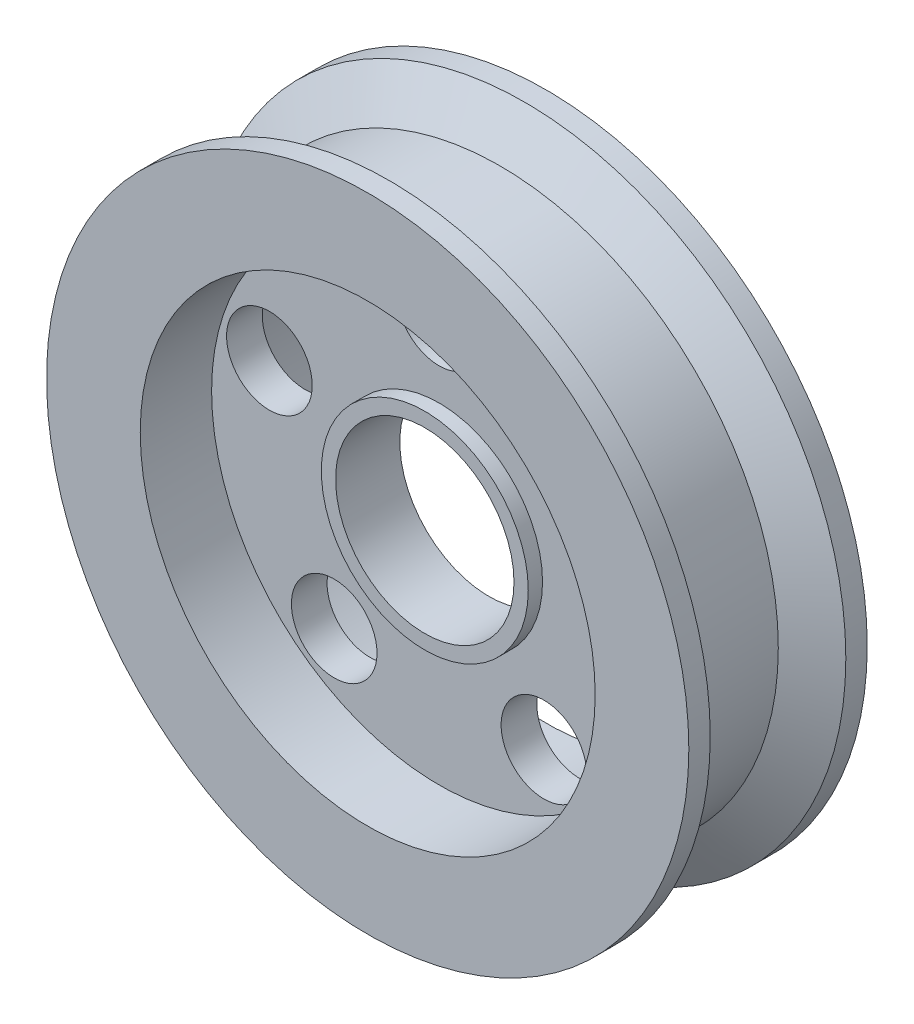
ISO-10303-21;
HEADER;
FILE_DESCRIPTION(('STEP AP214'),'2;1');
FILE_NAME('part.step','',(''),(''),'','','');
FILE_SCHEMA(('AUTOMOTIVE_DESIGN { 1 0 10303 214 1 1 1 1 }'));
ENDSEC;
DATA;
#1=APPLICATION_CONTEXT('core data for automotive mechanical design processes');
#2=APPLICATION_PROTOCOL_DEFINITION('international standard','automotive_design',2000,#1);
#3=PRODUCT_CONTEXT('',#1,'mechanical');
#4=PRODUCT('Part','Part','',(#3));
#5=PRODUCT_RELATED_PRODUCT_CATEGORY('part','',(#4));
#6=PRODUCT_DEFINITION_FORMATION('','',#4);
#7=PRODUCT_DEFINITION_CONTEXT('part definition',#1,'design');
#8=PRODUCT_DEFINITION('design','',#6,#7);
#9=PRODUCT_DEFINITION_SHAPE('','',#8);
#10=(LENGTH_UNIT() NAMED_UNIT(*) SI_UNIT(.MILLI.,.METRE.));
#11=(NAMED_UNIT(*) PLANE_ANGLE_UNIT() SI_UNIT($,.RADIAN.));
#12=(NAMED_UNIT(*) SI_UNIT($,.STERADIAN.) SOLID_ANGLE_UNIT());
#13=UNCERTAINTY_MEASURE_WITH_UNIT(LENGTH_MEASURE(1.E-05),#10,'distance_accuracy_value','');
#14=(GEOMETRIC_REPRESENTATION_CONTEXT(3) GLOBAL_UNCERTAINTY_ASSIGNED_CONTEXT((#13)) GLOBAL_UNIT_ASSIGNED_CONTEXT((#10,
#11,#12)) REPRESENTATION_CONTEXT('',''));
#15=CARTESIAN_POINT('',(0.,0.,0.));
#16=DIRECTION('',(0.,0.,1.));
#17=DIRECTION('',(1.,0.,0.));
#18=AXIS2_PLACEMENT_3D('',#15,#16,#17);
#19=CARTESIAN_POINT('',(0.,0.,12.5));
#20=DIRECTION('',(0.,0.,-1.));
#21=DIRECTION('',(-1.,0.,0.));
#22=AXIS2_PLACEMENT_3D('',#19,#20,#21);
#23=CYLINDRICAL_SURFACE('',#22,45.);
#24=CARTESIAN_POINT('',(0.,0.,-9.5));
#25=DIRECTION('',(0.,0.,1.));
#26=DIRECTION('',(1.,0.,0.));
#27=AXIS2_PLACEMENT_3D('',#24,#25,#26);
#28=CIRCLE('',#27,45.);
#29=CARTESIAN_POINT('',(45.,0.,-9.5));
#30=VERTEX_POINT('',#29);
#31=EDGE_CURVE('E174',#30,#30,#28,.T.);
#32=ORIENTED_EDGE('',*,*,#31,.F.);
#33=EDGE_LOOP('',(#32));
#34=FACE_BOUND('',#33,.T.);
#35=CARTESIAN_POINT('',(0.,0.,-12.5));
#36=DIRECTION('',(0.,0.,1.));
#37=DIRECTION('',(1.,0.,0.));
#38=AXIS2_PLACEMENT_3D('',#35,#36,#37);
#39=CIRCLE('',#38,45.);
#40=CARTESIAN_POINT('',(45.,0.,-12.5));
#41=VERTEX_POINT('',#40);
#42=EDGE_CURVE('E93',#41,#41,#39,.T.);
#43=ORIENTED_EDGE('',*,*,#42,.T.);
#44=EDGE_LOOP('',(#43));
#45=FACE_BOUND('',#44,.T.);
#46=ADVANCED_FACE('F47',(#34,#45),#23,.T.);
#47=CARTESIAN_POINT('',(0.,0.,12.5));
#48=DIRECTION('',(0.,0.,1.));
#49=DIRECTION('',(1.,0.,0.));
#50=AXIS2_PLACEMENT_3D('',#47,#48,#49);
#51=PLANE('',#50);
#52=CARTESIAN_POINT('',(0.,0.,12.5));
#53=DIRECTION('',(0.,0.,1.));
#54=DIRECTION('',(1.,0.,0.));
#55=AXIS2_PLACEMENT_3D('',#52,#53,#54);
#56=CIRCLE('',#55,31.875);
#57=CARTESIAN_POINT('',(31.875,0.,12.5));
#58=VERTEX_POINT('',#57);
#59=EDGE_CURVE('E86',#58,#58,#56,.T.);
#60=ORIENTED_EDGE('',*,*,#59,.F.);
#61=EDGE_LOOP('',(#60));
#62=FACE_BOUND('',#61,.T.);
#63=CARTESIAN_POINT('',(0.,0.,12.5));
#64=DIRECTION('',(0.,0.,1.));
#65=DIRECTION('',(1.,0.,0.));
#66=AXIS2_PLACEMENT_3D('',#63,#64,#65);
#67=CIRCLE('',#66,45.);
#68=CARTESIAN_POINT('',(45.,0.,12.5));
#69=VERTEX_POINT('',#68);
#70=EDGE_CURVE('E59',#69,#69,#67,.T.);
#71=ORIENTED_EDGE('',*,*,#70,.T.);
#72=EDGE_LOOP('',(#71));
#73=FACE_BOUND('',#72,.T.);
#74=ADVANCED_FACE('F140',(#62,#73),#51,.T.);
#75=CARTESIAN_POINT('',(0.,0.,-12.5));
#76=DIRECTION('',(0.,0.,1.));
#77=DIRECTION('',(1.,0.,0.));
#78=AXIS2_PLACEMENT_3D('',#75,#76,#77);
#79=PLANE('',#78);
#80=CARTESIAN_POINT('',(0.,0.,-12.5));
#81=DIRECTION('',(0.,0.,1.));
#82=DIRECTION('',(1.,0.,0.));
#83=AXIS2_PLACEMENT_3D('',#80,#81,#82);
#84=CIRCLE('',#83,31.875);
#85=CARTESIAN_POINT('',(31.875,0.,-12.5));
#86=VERTEX_POINT('',#85);
#87=EDGE_CURVE('E87',#86,#86,#84,.T.);
#88=ORIENTED_EDGE('',*,*,#87,.T.);
#89=EDGE_LOOP('',(#88));
#90=FACE_BOUND('',#89,.T.);
#91=ORIENTED_EDGE('',*,*,#42,.F.);
#92=EDGE_LOOP('',(#91));
#93=FACE_BOUND('',#92,.T.);
#94=ADVANCED_FACE('F137',(#90,#93),#79,.F.);
#95=CARTESIAN_POINT('',(0.,0.,9.5));
#96=DIRECTION('',(0.,0.,1.));
#97=DIRECTION('',(1.,0.,0.));
#98=AXIS2_PLACEMENT_3D('',#95,#96,#97);
#99=CIRCLE('',#98,45.);
#100=CARTESIAN_POINT('',(45.,0.,9.5));
#101=VERTEX_POINT('',#100);
#102=EDGE_CURVE('E162',#101,#101,#99,.T.);
#103=ORIENTED_EDGE('',*,*,#102,.T.);
#104=EDGE_LOOP('',(#103));
#105=FACE_BOUND('',#104,.T.);
#106=ORIENTED_EDGE('',*,*,#70,.F.);
#107=EDGE_LOOP('',(#106));
#108=FACE_BOUND('',#107,.T.);
#109=ADVANCED_FACE('F49',(#105,#108),#23,.T.);
#110=CARTESIAN_POINT('',(0.,0.,2.5));
#111=DIRECTION('',(0.,0.,1.));
#112=DIRECTION('',(1.,0.,0.));
#113=AXIS2_PLACEMENT_3D('',#110,#111,#112);
#114=CYLINDRICAL_SURFACE('',#113,31.875);
#115=CARTESIAN_POINT('',(0.,0.,2.5));
#116=DIRECTION('',(0.,0.,1.));
#117=DIRECTION('',(1.,0.,0.));
#118=AXIS2_PLACEMENT_3D('',#115,#116,#117);
#119=CIRCLE('',#118,31.875);
#120=CARTESIAN_POINT('',(31.875,0.,2.5));
#121=VERTEX_POINT('',#120);
#122=EDGE_CURVE('E90',#121,#121,#119,.T.);
#123=ORIENTED_EDGE('',*,*,#122,.F.);
#124=EDGE_LOOP('',(#123));
#125=FACE_BOUND('',#124,.T.);
#126=ORIENTED_EDGE('',*,*,#59,.T.);
#127=EDGE_LOOP('',(#126));
#128=FACE_BOUND('',#127,.T.);
#129=ADVANCED_FACE('F152',(#125,#128),#114,.F.);
#130=CARTESIAN_POINT('',(0.,0.,2.5));
#131=DIRECTION('',(0.,0.,1.));
#132=DIRECTION('',(1.,0.,0.));
#133=AXIS2_PLACEMENT_3D('',#130,#131,#132);
#134=PLANE('',#133);
#135=CARTESIAN_POINT('',(0.,0.,2.5));
#136=DIRECTION('',(0.,0.,1.));
#137=DIRECTION('',(1.,0.,0.));
#138=AXIS2_PLACEMENT_3D('',#135,#136,#137);
#139=CIRCLE('',#138,14.5);
#140=CARTESIAN_POINT('',(14.5,0.,2.5));
#141=VERTEX_POINT('',#140);
#142=EDGE_CURVE('E10',#141,#141,#139,.T.);
#143=ORIENTED_EDGE('',*,*,#142,.F.);
#144=EDGE_LOOP('',(#143));
#145=FACE_BOUND('',#144,.T.);
#146=CARTESIAN_POINT('',(-14.6946313073117,-20.2254248593738,2.5));
#147=DIRECTION('',(0.,0.,1.));
#148=DIRECTION('',(-0.809016994374951,0.587785252292469,0.));
#149=AXIS2_PLACEMENT_3D('',#146,#147,#148);
#150=CIRCLE('',#149,6.);
#151=CARTESIAN_POINT('',(-8.69463130731171,-20.2254248593738,2.5));
#152=VERTEX_POINT('',#151);
#153=EDGE_CURVE('E64',#152,#152,#150,.T.);
#154=ORIENTED_EDGE('',*,*,#153,.F.);
#155=EDGE_LOOP('',(#154));
#156=FACE_BOUND('',#155,.T.);
#157=CARTESIAN_POINT('',(14.694631307312,-20.2254248593736,2.5));
#158=DIRECTION('',(0.,0.,1.));
#159=DIRECTION('',(-0.809016994374942,-0.58778525229248,0.));
#160=AXIS2_PLACEMENT_3D('',#157,#158,#159);
#161=CIRCLE('',#160,6.);
#162=CARTESIAN_POINT('',(20.694631307312,-20.2254248593736,2.5));
#163=VERTEX_POINT('',#162);
#164=EDGE_CURVE('E68',#163,#163,#161,.T.);
#165=ORIENTED_EDGE('',*,*,#164,.F.);
#166=EDGE_LOOP('',(#165));
#167=FACE_BOUND('',#166,.T.);
#168=CARTESIAN_POINT('',(23.7764129073788,7.72542485937396,2.5));
#169=DIRECTION('',(0.,0.,1.));
#170=DIRECTION('',(0.309016994374958,-0.95105651629515,0.));
#171=AXIS2_PLACEMENT_3D('',#168,#169,#170);
#172=CIRCLE('',#171,6.);
#173=CARTESIAN_POINT('',(29.7764129073788,7.72542485937396,2.5));
#174=VERTEX_POINT('',#173);
#175=EDGE_CURVE('E71',#174,#174,#172,.T.);
#176=ORIENTED_EDGE('',*,*,#175,.F.);
#177=EDGE_LOOP('',(#176));
#178=FACE_BOUND('',#177,.T.);
#179=CARTESIAN_POINT('',(-23.7764129073789,7.72542485937362,2.5));
#180=DIRECTION('',(0.,0.,1.));
#181=DIRECTION('',(0.309016994374945,0.951056516295155,0.));
#182=AXIS2_PLACEMENT_3D('',#179,#180,#181);
#183=CIRCLE('',#182,6.);
#184=CARTESIAN_POINT('',(-17.7764129073789,7.72542485937362,2.5));
#185=VERTEX_POINT('',#184);
#186=EDGE_CURVE('E74',#185,#185,#183,.T.);
#187=ORIENTED_EDGE('',*,*,#186,.F.);
#188=EDGE_LOOP('',(#187));
#189=FACE_BOUND('',#188,.T.);
#190=CARTESIAN_POINT('',(0.,25.,2.5));
#191=DIRECTION('',(0.,0.,1.));
#192=DIRECTION('',(1.,0.,0.));
#193=AXIS2_PLACEMENT_3D('',#190,#191,#192);
#194=CIRCLE('',#193,6.);
#195=CARTESIAN_POINT('',(6.,25.,2.5));
#196=VERTEX_POINT('',#195);
#197=EDGE_CURVE('E79',#196,#196,#194,.T.);
#198=ORIENTED_EDGE('',*,*,#197,.F.);
#199=EDGE_LOOP('',(#198));
#200=FACE_BOUND('',#199,.T.);
#201=ORIENTED_EDGE('',*,*,#122,.T.);
#202=EDGE_LOOP('',(#201));
#203=FACE_BOUND('',#202,.T.);
#204=ADVANCED_FACE('F133',(#145,#156,#167,#178,#189,#200,#203),#134,.T.);
#205=CARTESIAN_POINT('',(0.,0.,-2.5));
#206=DIRECTION('',(0.,0.,-1.));
#207=DIRECTION('',(-1.,0.,0.));
#208=AXIS2_PLACEMENT_3D('',#205,#206,#207);
#209=CYLINDRICAL_SURFACE('',#208,31.875);
#210=CARTESIAN_POINT('',(0.,0.,-2.5));
#211=DIRECTION('',(0.,0.,1.));
#212=DIRECTION('',(1.,0.,0.));
#213=AXIS2_PLACEMENT_3D('',#210,#211,#212);
#214=CIRCLE('',#213,31.875);
#215=CARTESIAN_POINT('',(31.875,0.,-2.5));
#216=VERTEX_POINT('',#215);
#217=EDGE_CURVE('E83',#216,#216,#214,.T.);
#218=ORIENTED_EDGE('',*,*,#217,.T.);
#219=EDGE_LOOP('',(#218));
#220=FACE_BOUND('',#219,.T.);
#221=ORIENTED_EDGE('',*,*,#87,.F.);
#222=EDGE_LOOP('',(#221));
#223=FACE_BOUND('',#222,.T.);
#224=ADVANCED_FACE('F118',(#220,#223),#209,.F.);
#225=CARTESIAN_POINT('',(0.,0.,-2.5));
#226=DIRECTION('',(0.,0.,-1.));
#227=DIRECTION('',(1.,0.,0.));
#228=AXIS2_PLACEMENT_3D('',#225,#226,#227);
#229=PLANE('',#228);
#230=CARTESIAN_POINT('',(0.,0.,-2.5));
#231=DIRECTION('',(0.,0.,-1.));
#232=DIRECTION('',(-1.,0.,0.));
#233=AXIS2_PLACEMENT_3D('',#230,#231,#232);
#234=CIRCLE('',#233,14.5);
#235=CARTESIAN_POINT('',(-14.5,0.,-2.5));
#236=VERTEX_POINT('',#235);
#237=EDGE_CURVE('E51',#236,#236,#234,.T.);
#238=ORIENTED_EDGE('',*,*,#237,.F.);
#239=EDGE_LOOP('',(#238));
#240=FACE_BOUND('',#239,.T.);
#241=CARTESIAN_POINT('',(-14.6946313073117,-20.2254248593738,-2.5));
#242=DIRECTION('',(0.,0.,-1.));
#243=DIRECTION('',(-1.,0.,0.));
#244=AXIS2_PLACEMENT_3D('',#241,#242,#243);
#245=CIRCLE('',#244,6.);
#246=CARTESIAN_POINT('',(-8.69463130731171,-20.2254248593738,-2.5));
#247=VERTEX_POINT('',#246);
#248=EDGE_CURVE('E78',#247,#247,#245,.T.);
#249=ORIENTED_EDGE('',*,*,#248,.F.);
#250=EDGE_LOOP('',(#249));
#251=FACE_BOUND('',#250,.T.);
#252=CARTESIAN_POINT('',(14.694631307312,-20.2254248593736,-2.5));
#253=DIRECTION('',(0.,0.,-1.));
#254=DIRECTION('',(-1.,0.,0.));
#255=AXIS2_PLACEMENT_3D('',#252,#253,#254);
#256=CIRCLE('',#255,6.);
#257=CARTESIAN_POINT('',(20.694631307312,-20.2254248593736,-2.5));
#258=VERTEX_POINT('',#257);
#259=EDGE_CURVE('E106',#258,#258,#256,.T.);
#260=ORIENTED_EDGE('',*,*,#259,.F.);
#261=EDGE_LOOP('',(#260));
#262=FACE_BOUND('',#261,.T.);
#263=CARTESIAN_POINT('',(23.7764129073788,7.72542485937396,-2.5));
#264=DIRECTION('',(0.,0.,-1.));
#265=DIRECTION('',(-1.,0.,0.));
#266=AXIS2_PLACEMENT_3D('',#263,#264,#265);
#267=CIRCLE('',#266,6.);
#268=CARTESIAN_POINT('',(29.7764129073788,7.72542485937396,-2.5));
#269=VERTEX_POINT('',#268);
#270=EDGE_CURVE('E67',#269,#269,#267,.T.);
#271=ORIENTED_EDGE('',*,*,#270,.F.);
#272=EDGE_LOOP('',(#271));
#273=FACE_BOUND('',#272,.T.);
#274=CARTESIAN_POINT('',(-23.7764129073789,7.72542485937362,-2.5));
#275=DIRECTION('',(0.,0.,-1.));
#276=DIRECTION('',(-1.,0.,0.));
#277=AXIS2_PLACEMENT_3D('',#274,#275,#276);
#278=CIRCLE('',#277,6.);
#279=CARTESIAN_POINT('',(-17.7764129073789,7.72542485937362,-2.5));
#280=VERTEX_POINT('',#279);
#281=EDGE_CURVE('E77',#280,#280,#278,.T.);
#282=ORIENTED_EDGE('',*,*,#281,.F.);
#283=EDGE_LOOP('',(#282));
#284=FACE_BOUND('',#283,.T.);
#285=CARTESIAN_POINT('',(0.,25.,-2.5));
#286=DIRECTION('',(0.,0.,-1.));
#287=DIRECTION('',(-1.,0.,0.));
#288=AXIS2_PLACEMENT_3D('',#285,#286,#287);
#289=CIRCLE('',#288,6.);
#290=CARTESIAN_POINT('',(6.,25.,-2.5));
#291=VERTEX_POINT('',#290);
#292=EDGE_CURVE('E82',#291,#291,#289,.T.);
#293=ORIENTED_EDGE('',*,*,#292,.F.);
#294=EDGE_LOOP('',(#293));
#295=FACE_BOUND('',#294,.T.);
#296=ORIENTED_EDGE('',*,*,#217,.F.);
#297=EDGE_LOOP('',(#296));
#298=FACE_BOUND('',#297,.T.);
#299=ADVANCED_FACE('F114',(#240,#251,#262,#273,#284,#295,#298),#229,.T.);
#300=CARTESIAN_POINT('',(0.,25.,-12.5));
#301=DIRECTION('',(0.,0.,1.));
#302=DIRECTION('',(1.,0.,0.));
#303=AXIS2_PLACEMENT_3D('',#300,#301,#302);
#304=CYLINDRICAL_SURFACE('',#303,6.);
#305=CARTESIAN_POINT('',(6.,25.,-2.5));
#306=CARTESIAN_POINT('',(6.,25.,-2.44791666666667));
#307=CARTESIAN_POINT('',(6.,25.,-2.39583333333333));
#308=CARTESIAN_POINT('',(6.,25.,-2.29166666666667));
#309=CARTESIAN_POINT('',(6.,25.,-2.23958333333333));
#310=CARTESIAN_POINT('',(6.,25.,-2.13541666666667));
#311=CARTESIAN_POINT('',(6.,25.,-2.08333333333333));
#312=CARTESIAN_POINT('',(6.,25.,-1.97916666666667));
#313=CARTESIAN_POINT('',(6.,25.,-1.92708333333333));
#314=CARTESIAN_POINT('',(6.,25.,-1.82291666666667));
#315=CARTESIAN_POINT('',(6.,25.,-1.77083333333333));
#316=CARTESIAN_POINT('',(6.,25.,-1.66666666666667));
#317=CARTESIAN_POINT('',(6.,25.,-1.61458333333333));
#318=CARTESIAN_POINT('',(6.,25.,-1.51041666666667));
#319=CARTESIAN_POINT('',(6.,25.,-1.45833333333333));
#320=CARTESIAN_POINT('',(6.,25.,-1.35416666666667));
#321=CARTESIAN_POINT('',(6.,25.,-1.30208333333333));
#322=CARTESIAN_POINT('',(6.,25.,-1.19791666666667));
#323=CARTESIAN_POINT('',(6.,25.,-1.14583333333333));
#324=CARTESIAN_POINT('',(6.,25.,-1.04166666666667));
#325=CARTESIAN_POINT('',(6.,25.,-0.989583333333334));
#326=CARTESIAN_POINT('',(6.,25.,-0.885416666666668));
#327=CARTESIAN_POINT('',(6.,25.,-0.833333333333334));
#328=CARTESIAN_POINT('',(6.,25.,-0.729166666666667));
#329=CARTESIAN_POINT('',(6.,25.,-0.677083333333334));
#330=CARTESIAN_POINT('',(6.,25.,-0.572916666666667));
#331=CARTESIAN_POINT('',(6.,25.,-0.520833333333334));
#332=CARTESIAN_POINT('',(6.,25.,-0.416666666666667));
#333=CARTESIAN_POINT('',(6.,25.,-0.364583333333334));
#334=CARTESIAN_POINT('',(6.,25.,-0.260416666666667));
#335=CARTESIAN_POINT('',(6.,25.,-0.208333333333334));
#336=CARTESIAN_POINT('',(6.,25.,-0.104166666666667));
#337=CARTESIAN_POINT('',(6.,25.,-0.0520833333333334));
#338=CARTESIAN_POINT('',(6.,25.,0.0520833333333334));
#339=CARTESIAN_POINT('',(6.,25.,0.104166666666667));
#340=CARTESIAN_POINT('',(6.,25.,0.208333333333334));
#341=CARTESIAN_POINT('',(6.,25.,0.260416666666667));
#342=CARTESIAN_POINT('',(6.,25.,0.364583333333334));
#343=CARTESIAN_POINT('',(6.,25.,0.416666666666667));
#344=CARTESIAN_POINT('',(6.,25.,0.520833333333334));
#345=CARTESIAN_POINT('',(6.,25.,0.572916666666667));
#346=CARTESIAN_POINT('',(6.,25.,0.677083333333334));
#347=CARTESIAN_POINT('',(6.,25.,0.729166666666667));
#348=CARTESIAN_POINT('',(6.,25.,0.833333333333333));
#349=CARTESIAN_POINT('',(6.,25.,0.885416666666666));
#350=CARTESIAN_POINT('',(6.,25.,0.989583333333333));
#351=CARTESIAN_POINT('',(6.,25.,1.04166666666667));
#352=CARTESIAN_POINT('',(6.,25.,1.14583333333333));
#353=CARTESIAN_POINT('',(6.,25.,1.19791666666667));
#354=CARTESIAN_POINT('',(6.,25.,1.30208333333333));
#355=CARTESIAN_POINT('',(6.,25.,1.35416666666667));
#356=CARTESIAN_POINT('',(6.,25.,1.45833333333333));
#357=CARTESIAN_POINT('',(6.,25.,1.51041666666667));
#358=CARTESIAN_POINT('',(6.,25.,1.61458333333333));
#359=CARTESIAN_POINT('',(6.,25.,1.66666666666667));
#360=CARTESIAN_POINT('',(6.,25.,1.77083333333333));
#361=CARTESIAN_POINT('',(6.,25.,1.82291666666667));
#362=CARTESIAN_POINT('',(6.,25.,1.92708333333333));
#363=CARTESIAN_POINT('',(6.,25.,1.97916666666667));
#364=CARTESIAN_POINT('',(6.,25.,2.08333333333333));
#365=CARTESIAN_POINT('',(6.,25.,2.13541666666667));
#366=CARTESIAN_POINT('',(6.,25.,2.23958333333333));
#367=CARTESIAN_POINT('',(6.,25.,2.29166666666667));
#368=CARTESIAN_POINT('',(6.,25.,2.39583333333333));
#369=CARTESIAN_POINT('',(6.,25.,2.44791666666667));
#370=CARTESIAN_POINT('',(6.,25.,2.5));
#371=B_SPLINE_CURVE_WITH_KNOTS('',3,(#305,#306,#307,#308,#309,#310,#311,#312,#313,#314,#315,
#316,#317,#318,#319,#320,#321,#322,#323,#324,#325,#326,#327,#328,#329,#330,#331,#332,#333,#334,
#335,#336,#337,#338,#339,#340,#341,#342,#343,#344,#345,#346,#347,#348,#349,#350,#351,#352,#353,
#354,#355,#356,#357,#358,#359,#360,#361,#362,#363,#364,#365,#366,#367,#368,#369,#370),
.UNSPECIFIED.,.F.,.F.,(4,2,2,2,2,2,2,2,2,2,2,2,2,2,2,2,2,2,2,2,2,2,2,2,2,2,2,2,2,2,2,2,4),(0.,
0.15625,0.3125,0.46875,0.625000000000001,0.781250000000001,0.937500000000001,1.09375,1.25,
1.40625,1.5625,1.71875,1.875,2.03125,2.1875,2.34375,2.5,2.65625,2.8125,2.96875,3.125,3.28125,
3.4375,3.59375,3.75,3.90625,4.0625,4.21875,4.375,4.53125,4.6875,4.84375,5.),.UNSPECIFIED.);
#372=EDGE_CURVE('BSEAM117',#291,#196,#371,.T.);
#373=ORIENTED_EDGE('',*,*,#292,.T.);
#374=ORIENTED_EDGE('',*,*,#197,.T.);
#375=ORIENTED_EDGE('',*,*,#372,.T.);
#376=ORIENTED_EDGE('',*,*,#372,.F.);
#377=EDGE_LOOP('',(#373,#375,#374,#376));
#378=FACE_BOUND('',#377,.T.);
#379=ADVANCED_FACE('F117',(#378),#304,.F.);
#380=CARTESIAN_POINT('',(-23.7764129073789,7.72542485937362,-12.5));
#381=DIRECTION('',(0.,0.,1.));
#382=DIRECTION('',(1.,0.,0.));
#383=AXIS2_PLACEMENT_3D('',#380,#381,#382);
#384=CYLINDRICAL_SURFACE('',#383,6.);
#385=CARTESIAN_POINT('',(-17.7764129073789,7.72542485937362,-2.5));
#386=CARTESIAN_POINT('',(-17.7764129073789,7.72542485937362,-2.44791666666667));
#387=CARTESIAN_POINT('',(-17.7764129073789,7.72542485937362,-2.39583333333333));
#388=CARTESIAN_POINT('',(-17.7764129073789,7.72542485937362,-2.29166666666667));
#389=CARTESIAN_POINT('',(-17.7764129073789,7.72542485937362,-2.23958333333333));
#390=CARTESIAN_POINT('',(-17.7764129073789,7.72542485937362,-2.13541666666667));
#391=CARTESIAN_POINT('',(-17.7764129073789,7.72542485937362,-2.08333333333333));
#392=CARTESIAN_POINT('',(-17.7764129073789,7.72542485937362,-1.97916666666667));
#393=CARTESIAN_POINT('',(-17.7764129073789,7.72542485937362,-1.92708333333333));
#394=CARTESIAN_POINT('',(-17.7764129073789,7.72542485937362,-1.82291666666667));
#395=CARTESIAN_POINT('',(-17.7764129073789,7.72542485937362,-1.77083333333333));
#396=CARTESIAN_POINT('',(-17.7764129073789,7.72542485937362,-1.66666666666667));
#397=CARTESIAN_POINT('',(-17.7764129073789,7.72542485937362,-1.61458333333333));
#398=CARTESIAN_POINT('',(-17.7764129073789,7.72542485937362,-1.51041666666667));
#399=CARTESIAN_POINT('',(-17.7764129073789,7.72542485937362,-1.45833333333333));
#400=CARTESIAN_POINT('',(-17.7764129073789,7.72542485937362,-1.35416666666667));
#401=CARTESIAN_POINT('',(-17.7764129073789,7.72542485937362,-1.30208333333333));
#402=CARTESIAN_POINT('',(-17.7764129073789,7.72542485937362,-1.19791666666667));
#403=CARTESIAN_POINT('',(-17.7764129073789,7.72542485937362,-1.14583333333333));
#404=CARTESIAN_POINT('',(-17.7764129073789,7.72542485937362,-1.04166666666667));
#405=CARTESIAN_POINT('',(-17.7764129073789,7.72542485937362,-0.989583333333334));
#406=CARTESIAN_POINT('',(-17.7764129073789,7.72542485937362,-0.885416666666668));
#407=CARTESIAN_POINT('',(-17.7764129073789,7.72542485937362,-0.833333333333334));
#408=CARTESIAN_POINT('',(-17.7764129073789,7.72542485937362,-0.729166666666667));
#409=CARTESIAN_POINT('',(-17.7764129073789,7.72542485937362,-0.677083333333334));
#410=CARTESIAN_POINT('',(-17.7764129073789,7.72542485937362,-0.572916666666667));
#411=CARTESIAN_POINT('',(-17.7764129073789,7.72542485937362,-0.520833333333334));
#412=CARTESIAN_POINT('',(-17.7764129073789,7.72542485937362,-0.416666666666667));
#413=CARTESIAN_POINT('',(-17.7764129073789,7.72542485937362,-0.364583333333334));
#414=CARTESIAN_POINT('',(-17.7764129073789,7.72542485937362,-0.260416666666667));
#415=CARTESIAN_POINT('',(-17.7764129073789,7.72542485937362,-0.208333333333334));
#416=CARTESIAN_POINT('',(-17.7764129073789,7.72542485937362,-0.104166666666667));
#417=CARTESIAN_POINT('',(-17.7764129073789,7.72542485937362,-0.0520833333333334));
#418=CARTESIAN_POINT('',(-17.7764129073789,7.72542485937362,0.0520833333333334));
#419=CARTESIAN_POINT('',(-17.7764129073789,7.72542485937362,0.104166666666667));
#420=CARTESIAN_POINT('',(-17.7764129073789,7.72542485937362,0.208333333333334));
#421=CARTESIAN_POINT('',(-17.7764129073789,7.72542485937362,0.260416666666667));
#422=CARTESIAN_POINT('',(-17.7764129073789,7.72542485937362,0.364583333333334));
#423=CARTESIAN_POINT('',(-17.7764129073789,7.72542485937362,0.416666666666667));
#424=CARTESIAN_POINT('',(-17.7764129073789,7.72542485937362,0.520833333333334));
#425=CARTESIAN_POINT('',(-17.7764129073789,7.72542485937362,0.572916666666667));
#426=CARTESIAN_POINT('',(-17.7764129073789,7.72542485937362,0.677083333333334));
#427=CARTESIAN_POINT('',(-17.7764129073789,7.72542485937362,0.729166666666667));
#428=CARTESIAN_POINT('',(-17.7764129073789,7.72542485937362,0.833333333333333));
#429=CARTESIAN_POINT('',(-17.7764129073789,7.72542485937362,0.885416666666666));
#430=CARTESIAN_POINT('',(-17.7764129073789,7.72542485937362,0.989583333333333));
#431=CARTESIAN_POINT('',(-17.7764129073789,7.72542485937362,1.04166666666667));
#432=CARTESIAN_POINT('',(-17.7764129073789,7.72542485937362,1.14583333333333));
#433=CARTESIAN_POINT('',(-17.7764129073789,7.72542485937362,1.19791666666667));
#434=CARTESIAN_POINT('',(-17.7764129073789,7.72542485937362,1.30208333333333));
#435=CARTESIAN_POINT('',(-17.7764129073789,7.72542485937362,1.35416666666667));
#436=CARTESIAN_POINT('',(-17.7764129073789,7.72542485937362,1.45833333333333));
#437=CARTESIAN_POINT('',(-17.7764129073789,7.72542485937362,1.51041666666667));
#438=CARTESIAN_POINT('',(-17.7764129073789,7.72542485937362,1.61458333333333));
#439=CARTESIAN_POINT('',(-17.7764129073789,7.72542485937362,1.66666666666667));
#440=CARTESIAN_POINT('',(-17.7764129073789,7.72542485937362,1.77083333333333));
#441=CARTESIAN_POINT('',(-17.7764129073789,7.72542485937362,1.82291666666667));
#442=CARTESIAN_POINT('',(-17.7764129073789,7.72542485937362,1.92708333333333));
#443=CARTESIAN_POINT('',(-17.7764129073789,7.72542485937362,1.97916666666667));
#444=CARTESIAN_POINT('',(-17.7764129073789,7.72542485937362,2.08333333333333));
#445=CARTESIAN_POINT('',(-17.7764129073789,7.72542485937362,2.13541666666667));
#446=CARTESIAN_POINT('',(-17.7764129073789,7.72542485937362,2.23958333333333));
#447=CARTESIAN_POINT('',(-17.7764129073789,7.72542485937362,2.29166666666667));
#448=CARTESIAN_POINT('',(-17.7764129073789,7.72542485937362,2.39583333333333));
#449=CARTESIAN_POINT('',(-17.7764129073789,7.72542485937362,2.44791666666667));
#450=CARTESIAN_POINT('',(-17.7764129073789,7.72542485937362,2.5));
#451=B_SPLINE_CURVE_WITH_KNOTS('',3,(#385,#386,#387,#388,#389,#390,#391,#392,#393,#394,#395,
#396,#397,#398,#399,#400,#401,#402,#403,#404,#405,#406,#407,#408,#409,#410,#411,#412,#413,#414,
#415,#416,#417,#418,#419,#420,#421,#422,#423,#424,#425,#426,#427,#428,#429,#430,#431,#432,#433,
#434,#435,#436,#437,#438,#439,#440,#441,#442,#443,#444,#445,#446,#447,#448,#449,#450),
.UNSPECIFIED.,.F.,.F.,(4,2,2,2,2,2,2,2,2,2,2,2,2,2,2,2,2,2,2,2,2,2,2,2,2,2,2,2,2,2,2,2,4),(0.,
0.15625,0.3125,0.46875,0.625000000000001,0.781250000000001,0.937500000000001,1.09375,1.25,
1.40625,1.5625,1.71875,1.875,2.03125,2.1875,2.34375,2.5,2.65625,2.8125,2.96875,3.125,3.28125,
3.4375,3.59375,3.75,3.90625,4.0625,4.21875,4.375,4.53125,4.6875,4.84375,5.),.UNSPECIFIED.);
#452=EDGE_CURVE('BSEAM214',#280,#185,#451,.T.);
#453=ORIENTED_EDGE('',*,*,#281,.T.);
#454=ORIENTED_EDGE('',*,*,#186,.T.);
#455=ORIENTED_EDGE('',*,*,#452,.T.);
#456=ORIENTED_EDGE('',*,*,#452,.F.);
#457=EDGE_LOOP('',(#453,#455,#454,#456));
#458=FACE_BOUND('',#457,.T.);
#459=ADVANCED_FACE('F214',(#458),#384,.F.);
#460=CARTESIAN_POINT('',(23.7764129073788,7.72542485937396,-12.5));
#461=DIRECTION('',(0.,0.,1.));
#462=DIRECTION('',(1.,0.,0.));
#463=AXIS2_PLACEMENT_3D('',#460,#461,#462);
#464=CYLINDRICAL_SURFACE('',#463,6.);
#465=CARTESIAN_POINT('',(29.7764129073788,7.72542485937396,-2.5));
#466=CARTESIAN_POINT('',(29.7764129073788,7.72542485937396,-2.44791666666667));
#467=CARTESIAN_POINT('',(29.7764129073788,7.72542485937396,-2.39583333333333));
#468=CARTESIAN_POINT('',(29.7764129073788,7.72542485937396,-2.29166666666667));
#469=CARTESIAN_POINT('',(29.7764129073788,7.72542485937396,-2.23958333333333));
#470=CARTESIAN_POINT('',(29.7764129073788,7.72542485937396,-2.13541666666667));
#471=CARTESIAN_POINT('',(29.7764129073788,7.72542485937396,-2.08333333333333));
#472=CARTESIAN_POINT('',(29.7764129073788,7.72542485937396,-1.97916666666667));
#473=CARTESIAN_POINT('',(29.7764129073788,7.72542485937396,-1.92708333333333));
#474=CARTESIAN_POINT('',(29.7764129073788,7.72542485937396,-1.82291666666667));
#475=CARTESIAN_POINT('',(29.7764129073788,7.72542485937396,-1.77083333333333));
#476=CARTESIAN_POINT('',(29.7764129073788,7.72542485937396,-1.66666666666667));
#477=CARTESIAN_POINT('',(29.7764129073788,7.72542485937396,-1.61458333333333));
#478=CARTESIAN_POINT('',(29.7764129073788,7.72542485937396,-1.51041666666667));
#479=CARTESIAN_POINT('',(29.7764129073788,7.72542485937396,-1.45833333333333));
#480=CARTESIAN_POINT('',(29.7764129073788,7.72542485937396,-1.35416666666667));
#481=CARTESIAN_POINT('',(29.7764129073788,7.72542485937396,-1.30208333333333));
#482=CARTESIAN_POINT('',(29.7764129073788,7.72542485937396,-1.19791666666667));
#483=CARTESIAN_POINT('',(29.7764129073788,7.72542485937396,-1.14583333333333));
#484=CARTESIAN_POINT('',(29.7764129073788,7.72542485937396,-1.04166666666667));
#485=CARTESIAN_POINT('',(29.7764129073788,7.72542485937396,-0.989583333333334));
#486=CARTESIAN_POINT('',(29.7764129073788,7.72542485937396,-0.885416666666668));
#487=CARTESIAN_POINT('',(29.7764129073788,7.72542485937396,-0.833333333333334));
#488=CARTESIAN_POINT('',(29.7764129073788,7.72542485937396,-0.729166666666667));
#489=CARTESIAN_POINT('',(29.7764129073788,7.72542485937396,-0.677083333333334));
#490=CARTESIAN_POINT('',(29.7764129073788,7.72542485937396,-0.572916666666667));
#491=CARTESIAN_POINT('',(29.7764129073788,7.72542485937396,-0.520833333333334));
#492=CARTESIAN_POINT('',(29.7764129073788,7.72542485937396,-0.416666666666667));
#493=CARTESIAN_POINT('',(29.7764129073788,7.72542485937396,-0.364583333333334));
#494=CARTESIAN_POINT('',(29.7764129073788,7.72542485937396,-0.260416666666667));
#495=CARTESIAN_POINT('',(29.7764129073788,7.72542485937396,-0.208333333333334));
#496=CARTESIAN_POINT('',(29.7764129073788,7.72542485937396,-0.104166666666667));
#497=CARTESIAN_POINT('',(29.7764129073788,7.72542485937396,-0.0520833333333334));
#498=CARTESIAN_POINT('',(29.7764129073788,7.72542485937396,0.0520833333333334));
#499=CARTESIAN_POINT('',(29.7764129073788,7.72542485937396,0.104166666666667));
#500=CARTESIAN_POINT('',(29.7764129073788,7.72542485937396,0.208333333333334));
#501=CARTESIAN_POINT('',(29.7764129073788,7.72542485937396,0.260416666666667));
#502=CARTESIAN_POINT('',(29.7764129073788,7.72542485937396,0.364583333333334));
#503=CARTESIAN_POINT('',(29.7764129073788,7.72542485937396,0.416666666666667));
#504=CARTESIAN_POINT('',(29.7764129073788,7.72542485937396,0.520833333333334));
#505=CARTESIAN_POINT('',(29.7764129073788,7.72542485937396,0.572916666666667));
#506=CARTESIAN_POINT('',(29.7764129073788,7.72542485937396,0.677083333333334));
#507=CARTESIAN_POINT('',(29.7764129073788,7.72542485937396,0.729166666666667));
#508=CARTESIAN_POINT('',(29.7764129073788,7.72542485937396,0.833333333333333));
#509=CARTESIAN_POINT('',(29.7764129073788,7.72542485937396,0.885416666666666));
#510=CARTESIAN_POINT('',(29.7764129073788,7.72542485937396,0.989583333333333));
#511=CARTESIAN_POINT('',(29.7764129073788,7.72542485937396,1.04166666666667));
#512=CARTESIAN_POINT('',(29.7764129073788,7.72542485937396,1.14583333333333));
#513=CARTESIAN_POINT('',(29.7764129073788,7.72542485937396,1.19791666666667));
#514=CARTESIAN_POINT('',(29.7764129073788,7.72542485937396,1.30208333333333));
#515=CARTESIAN_POINT('',(29.7764129073788,7.72542485937396,1.35416666666667));
#516=CARTESIAN_POINT('',(29.7764129073788,7.72542485937396,1.45833333333333));
#517=CARTESIAN_POINT('',(29.7764129073788,7.72542485937396,1.51041666666667));
#518=CARTESIAN_POINT('',(29.7764129073788,7.72542485937396,1.61458333333333));
#519=CARTESIAN_POINT('',(29.7764129073788,7.72542485937396,1.66666666666667));
#520=CARTESIAN_POINT('',(29.7764129073788,7.72542485937396,1.77083333333333));
#521=CARTESIAN_POINT('',(29.7764129073788,7.72542485937396,1.82291666666667));
#522=CARTESIAN_POINT('',(29.7764129073788,7.72542485937396,1.92708333333333));
#523=CARTESIAN_POINT('',(29.7764129073788,7.72542485937396,1.97916666666667));
#524=CARTESIAN_POINT('',(29.7764129073788,7.72542485937396,2.08333333333333));
#525=CARTESIAN_POINT('',(29.7764129073788,7.72542485937396,2.13541666666667));
#526=CARTESIAN_POINT('',(29.7764129073788,7.72542485937396,2.23958333333333));
#527=CARTESIAN_POINT('',(29.7764129073788,7.72542485937396,2.29166666666667));
#528=CARTESIAN_POINT('',(29.7764129073788,7.72542485937396,2.39583333333333));
#529=CARTESIAN_POINT('',(29.7764129073788,7.72542485937396,2.44791666666667));
#530=CARTESIAN_POINT('',(29.7764129073788,7.72542485937396,2.5));
#531=B_SPLINE_CURVE_WITH_KNOTS('',3,(#465,#466,#467,#468,#469,#470,#471,#472,#473,#474,#475,
#476,#477,#478,#479,#480,#481,#482,#483,#484,#485,#486,#487,#488,#489,#490,#491,#492,#493,#494,
#495,#496,#497,#498,#499,#500,#501,#502,#503,#504,#505,#506,#507,#508,#509,#510,#511,#512,#513,
#514,#515,#516,#517,#518,#519,#520,#521,#522,#523,#524,#525,#526,#527,#528,#529,#530),
.UNSPECIFIED.,.F.,.F.,(4,2,2,2,2,2,2,2,2,2,2,2,2,2,2,2,2,2,2,2,2,2,2,2,2,2,2,2,2,2,2,2,4),(0.,
0.15625,0.3125,0.46875,0.625000000000001,0.781250000000001,0.937500000000001,1.09375,1.25,
1.40625,1.5625,1.71875,1.875,2.03125,2.1875,2.34375,2.5,2.65625,2.8125,2.96875,3.125,3.28125,
3.4375,3.59375,3.75,3.90625,4.0625,4.21875,4.375,4.53125,4.6875,4.84375,5.),.UNSPECIFIED.);
#532=EDGE_CURVE('BSEAM210',#269,#174,#531,.T.);
#533=ORIENTED_EDGE('',*,*,#270,.T.);
#534=ORIENTED_EDGE('',*,*,#175,.T.);
#535=ORIENTED_EDGE('',*,*,#532,.T.);
#536=ORIENTED_EDGE('',*,*,#532,.F.);
#537=EDGE_LOOP('',(#533,#535,#534,#536));
#538=FACE_BOUND('',#537,.T.);
#539=ADVANCED_FACE('F210',(#538),#464,.F.);
#540=CARTESIAN_POINT('',(14.694631307312,-20.2254248593736,-12.5));
#541=DIRECTION('',(0.,0.,1.));
#542=DIRECTION('',(1.,0.,0.));
#543=AXIS2_PLACEMENT_3D('',#540,#541,#542);
#544=CYLINDRICAL_SURFACE('',#543,6.);
#545=CARTESIAN_POINT('',(20.694631307312,-20.2254248593736,-2.5));
#546=CARTESIAN_POINT('',(20.694631307312,-20.2254248593736,-2.44791666666667));
#547=CARTESIAN_POINT('',(20.694631307312,-20.2254248593736,-2.39583333333333));
#548=CARTESIAN_POINT('',(20.694631307312,-20.2254248593736,-2.29166666666667));
#549=CARTESIAN_POINT('',(20.694631307312,-20.2254248593736,-2.23958333333333));
#550=CARTESIAN_POINT('',(20.694631307312,-20.2254248593736,-2.13541666666667));
#551=CARTESIAN_POINT('',(20.694631307312,-20.2254248593736,-2.08333333333333));
#552=CARTESIAN_POINT('',(20.694631307312,-20.2254248593736,-1.97916666666667));
#553=CARTESIAN_POINT('',(20.694631307312,-20.2254248593736,-1.92708333333333));
#554=CARTESIAN_POINT('',(20.694631307312,-20.2254248593736,-1.82291666666667));
#555=CARTESIAN_POINT('',(20.694631307312,-20.2254248593736,-1.77083333333333));
#556=CARTESIAN_POINT('',(20.694631307312,-20.2254248593736,-1.66666666666667));
#557=CARTESIAN_POINT('',(20.694631307312,-20.2254248593736,-1.61458333333333));
#558=CARTESIAN_POINT('',(20.694631307312,-20.2254248593736,-1.51041666666667));
#559=CARTESIAN_POINT('',(20.694631307312,-20.2254248593736,-1.45833333333333));
#560=CARTESIAN_POINT('',(20.694631307312,-20.2254248593736,-1.35416666666667));
#561=CARTESIAN_POINT('',(20.694631307312,-20.2254248593736,-1.30208333333333));
#562=CARTESIAN_POINT('',(20.694631307312,-20.2254248593736,-1.19791666666667));
#563=CARTESIAN_POINT('',(20.694631307312,-20.2254248593736,-1.14583333333333));
#564=CARTESIAN_POINT('',(20.694631307312,-20.2254248593736,-1.04166666666667));
#565=CARTESIAN_POINT('',(20.694631307312,-20.2254248593736,-0.989583333333334));
#566=CARTESIAN_POINT('',(20.694631307312,-20.2254248593736,-0.885416666666668));
#567=CARTESIAN_POINT('',(20.694631307312,-20.2254248593736,-0.833333333333334));
#568=CARTESIAN_POINT('',(20.694631307312,-20.2254248593736,-0.729166666666667));
#569=CARTESIAN_POINT('',(20.694631307312,-20.2254248593736,-0.677083333333334));
#570=CARTESIAN_POINT('',(20.694631307312,-20.2254248593736,-0.572916666666667));
#571=CARTESIAN_POINT('',(20.694631307312,-20.2254248593736,-0.520833333333334));
#572=CARTESIAN_POINT('',(20.694631307312,-20.2254248593736,-0.416666666666667));
#573=CARTESIAN_POINT('',(20.694631307312,-20.2254248593736,-0.364583333333334));
#574=CARTESIAN_POINT('',(20.694631307312,-20.2254248593736,-0.260416666666667));
#575=CARTESIAN_POINT('',(20.694631307312,-20.2254248593736,-0.208333333333334));
#576=CARTESIAN_POINT('',(20.694631307312,-20.2254248593736,-0.104166666666667));
#577=CARTESIAN_POINT('',(20.694631307312,-20.2254248593736,-0.0520833333333334));
#578=CARTESIAN_POINT('',(20.694631307312,-20.2254248593736,0.0520833333333334));
#579=CARTESIAN_POINT('',(20.694631307312,-20.2254248593736,0.104166666666667));
#580=CARTESIAN_POINT('',(20.694631307312,-20.2254248593736,0.208333333333334));
#581=CARTESIAN_POINT('',(20.694631307312,-20.2254248593736,0.260416666666667));
#582=CARTESIAN_POINT('',(20.694631307312,-20.2254248593736,0.364583333333334));
#583=CARTESIAN_POINT('',(20.694631307312,-20.2254248593736,0.416666666666667));
#584=CARTESIAN_POINT('',(20.694631307312,-20.2254248593736,0.520833333333334));
#585=CARTESIAN_POINT('',(20.694631307312,-20.2254248593736,0.572916666666667));
#586=CARTESIAN_POINT('',(20.694631307312,-20.2254248593736,0.677083333333334));
#587=CARTESIAN_POINT('',(20.694631307312,-20.2254248593736,0.729166666666667));
#588=CARTESIAN_POINT('',(20.694631307312,-20.2254248593736,0.833333333333333));
#589=CARTESIAN_POINT('',(20.694631307312,-20.2254248593736,0.885416666666666));
#590=CARTESIAN_POINT('',(20.694631307312,-20.2254248593736,0.989583333333333));
#591=CARTESIAN_POINT('',(20.694631307312,-20.2254248593736,1.04166666666667));
#592=CARTESIAN_POINT('',(20.694631307312,-20.2254248593736,1.14583333333333));
#593=CARTESIAN_POINT('',(20.694631307312,-20.2254248593736,1.19791666666667));
#594=CARTESIAN_POINT('',(20.694631307312,-20.2254248593736,1.30208333333333));
#595=CARTESIAN_POINT('',(20.694631307312,-20.2254248593736,1.35416666666667));
#596=CARTESIAN_POINT('',(20.694631307312,-20.2254248593736,1.45833333333333));
#597=CARTESIAN_POINT('',(20.694631307312,-20.2254248593736,1.51041666666667));
#598=CARTESIAN_POINT('',(20.694631307312,-20.2254248593736,1.61458333333333));
#599=CARTESIAN_POINT('',(20.694631307312,-20.2254248593736,1.66666666666667));
#600=CARTESIAN_POINT('',(20.694631307312,-20.2254248593736,1.77083333333333));
#601=CARTESIAN_POINT('',(20.694631307312,-20.2254248593736,1.82291666666667));
#602=CARTESIAN_POINT('',(20.694631307312,-20.2254248593736,1.92708333333333));
#603=CARTESIAN_POINT('',(20.694631307312,-20.2254248593736,1.97916666666667));
#604=CARTESIAN_POINT('',(20.694631307312,-20.2254248593736,2.08333333333333));
#605=CARTESIAN_POINT('',(20.694631307312,-20.2254248593736,2.13541666666667));
#606=CARTESIAN_POINT('',(20.694631307312,-20.2254248593736,2.23958333333333));
#607=CARTESIAN_POINT('',(20.694631307312,-20.2254248593736,2.29166666666667));
#608=CARTESIAN_POINT('',(20.694631307312,-20.2254248593736,2.39583333333333));
#609=CARTESIAN_POINT('',(20.694631307312,-20.2254248593736,2.44791666666667));
#610=CARTESIAN_POINT('',(20.694631307312,-20.2254248593736,2.5));
#611=B_SPLINE_CURVE_WITH_KNOTS('',3,(#545,#546,#547,#548,#549,#550,#551,#552,#553,#554,#555,
#556,#557,#558,#559,#560,#561,#562,#563,#564,#565,#566,#567,#568,#569,#570,#571,#572,#573,#574,
#575,#576,#577,#578,#579,#580,#581,#582,#583,#584,#585,#586,#587,#588,#589,#590,#591,#592,#593,
#594,#595,#596,#597,#598,#599,#600,#601,#602,#603,#604,#605,#606,#607,#608,#609,#610),
.UNSPECIFIED.,.F.,.F.,(4,2,2,2,2,2,2,2,2,2,2,2,2,2,2,2,2,2,2,2,2,2,2,2,2,2,2,2,2,2,2,2,4),(0.,
0.15625,0.3125,0.46875,0.625000000000001,0.781250000000001,0.937500000000001,1.09375,1.25,
1.40625,1.5625,1.71875,1.875,2.03125,2.1875,2.34375,2.5,2.65625,2.8125,2.96875,3.125,3.28125,
3.4375,3.59375,3.75,3.90625,4.0625,4.21875,4.375,4.53125,4.6875,4.84375,5.),.UNSPECIFIED.);
#612=EDGE_CURVE('BSEAM207',#258,#163,#611,.T.);
#613=ORIENTED_EDGE('',*,*,#259,.T.);
#614=ORIENTED_EDGE('',*,*,#164,.T.);
#615=ORIENTED_EDGE('',*,*,#612,.T.);
#616=ORIENTED_EDGE('',*,*,#612,.F.);
#617=EDGE_LOOP('',(#613,#615,#614,#616));
#618=FACE_BOUND('',#617,.T.);
#619=ADVANCED_FACE('F207',(#618),#544,.F.);
#620=CARTESIAN_POINT('',(-14.6946313073117,-20.2254248593738,-12.5));
#621=DIRECTION('',(0.,0.,1.));
#622=DIRECTION('',(1.,0.,0.));
#623=AXIS2_PLACEMENT_3D('',#620,#621,#622);
#624=CYLINDRICAL_SURFACE('',#623,6.);
#625=CARTESIAN_POINT('',(-8.69463130731171,-20.2254248593738,-2.5));
#626=CARTESIAN_POINT('',(-8.69463130731171,-20.2254248593738,-2.44791666666667));
#627=CARTESIAN_POINT('',(-8.69463130731171,-20.2254248593738,-2.39583333333333));
#628=CARTESIAN_POINT('',(-8.69463130731171,-20.2254248593738,-2.29166666666667));
#629=CARTESIAN_POINT('',(-8.69463130731171,-20.2254248593738,-2.23958333333333));
#630=CARTESIAN_POINT('',(-8.69463130731171,-20.2254248593738,-2.13541666666667));
#631=CARTESIAN_POINT('',(-8.69463130731171,-20.2254248593738,-2.08333333333333));
#632=CARTESIAN_POINT('',(-8.69463130731171,-20.2254248593738,-1.97916666666667));
#633=CARTESIAN_POINT('',(-8.69463130731171,-20.2254248593738,-1.92708333333333));
#634=CARTESIAN_POINT('',(-8.69463130731171,-20.2254248593738,-1.82291666666667));
#635=CARTESIAN_POINT('',(-8.69463130731171,-20.2254248593738,-1.77083333333333));
#636=CARTESIAN_POINT('',(-8.69463130731171,-20.2254248593738,-1.66666666666667));
#637=CARTESIAN_POINT('',(-8.69463130731171,-20.2254248593738,-1.61458333333333));
#638=CARTESIAN_POINT('',(-8.69463130731171,-20.2254248593738,-1.51041666666667));
#639=CARTESIAN_POINT('',(-8.69463130731171,-20.2254248593738,-1.45833333333333));
#640=CARTESIAN_POINT('',(-8.69463130731171,-20.2254248593738,-1.35416666666667));
#641=CARTESIAN_POINT('',(-8.69463130731171,-20.2254248593738,-1.30208333333333));
#642=CARTESIAN_POINT('',(-8.69463130731171,-20.2254248593738,-1.19791666666667));
#643=CARTESIAN_POINT('',(-8.69463130731171,-20.2254248593738,-1.14583333333333));
#644=CARTESIAN_POINT('',(-8.69463130731171,-20.2254248593738,-1.04166666666667));
#645=CARTESIAN_POINT('',(-8.69463130731171,-20.2254248593738,-0.989583333333334));
#646=CARTESIAN_POINT('',(-8.69463130731171,-20.2254248593738,-0.885416666666668));
#647=CARTESIAN_POINT('',(-8.69463130731171,-20.2254248593738,-0.833333333333334));
#648=CARTESIAN_POINT('',(-8.69463130731171,-20.2254248593738,-0.729166666666667));
#649=CARTESIAN_POINT('',(-8.69463130731171,-20.2254248593738,-0.677083333333334));
#650=CARTESIAN_POINT('',(-8.69463130731171,-20.2254248593738,-0.572916666666667));
#651=CARTESIAN_POINT('',(-8.69463130731171,-20.2254248593738,-0.520833333333334));
#652=CARTESIAN_POINT('',(-8.69463130731171,-20.2254248593738,-0.416666666666667));
#653=CARTESIAN_POINT('',(-8.69463130731171,-20.2254248593738,-0.364583333333334));
#654=CARTESIAN_POINT('',(-8.69463130731171,-20.2254248593738,-0.260416666666667));
#655=CARTESIAN_POINT('',(-8.69463130731171,-20.2254248593738,-0.208333333333334));
#656=CARTESIAN_POINT('',(-8.69463130731171,-20.2254248593738,-0.104166666666667));
#657=CARTESIAN_POINT('',(-8.69463130731171,-20.2254248593738,-0.0520833333333334));
#658=CARTESIAN_POINT('',(-8.69463130731171,-20.2254248593738,0.0520833333333334));
#659=CARTESIAN_POINT('',(-8.69463130731171,-20.2254248593738,0.104166666666667));
#660=CARTESIAN_POINT('',(-8.69463130731171,-20.2254248593738,0.208333333333334));
#661=CARTESIAN_POINT('',(-8.69463130731171,-20.2254248593738,0.260416666666667));
#662=CARTESIAN_POINT('',(-8.69463130731171,-20.2254248593738,0.364583333333334));
#663=CARTESIAN_POINT('',(-8.69463130731171,-20.2254248593738,0.416666666666667));
#664=CARTESIAN_POINT('',(-8.69463130731171,-20.2254248593738,0.520833333333334));
#665=CARTESIAN_POINT('',(-8.69463130731171,-20.2254248593738,0.572916666666667));
#666=CARTESIAN_POINT('',(-8.69463130731171,-20.2254248593738,0.677083333333334));
#667=CARTESIAN_POINT('',(-8.69463130731171,-20.2254248593738,0.729166666666667));
#668=CARTESIAN_POINT('',(-8.69463130731171,-20.2254248593738,0.833333333333333));
#669=CARTESIAN_POINT('',(-8.69463130731171,-20.2254248593738,0.885416666666666));
#670=CARTESIAN_POINT('',(-8.69463130731171,-20.2254248593738,0.989583333333333));
#671=CARTESIAN_POINT('',(-8.69463130731171,-20.2254248593738,1.04166666666667));
#672=CARTESIAN_POINT('',(-8.69463130731171,-20.2254248593738,1.14583333333333));
#673=CARTESIAN_POINT('',(-8.69463130731171,-20.2254248593738,1.19791666666667));
#674=CARTESIAN_POINT('',(-8.69463130731171,-20.2254248593738,1.30208333333333));
#675=CARTESIAN_POINT('',(-8.69463130731171,-20.2254248593738,1.35416666666667));
#676=CARTESIAN_POINT('',(-8.69463130731171,-20.2254248593738,1.45833333333333));
#677=CARTESIAN_POINT('',(-8.69463130731171,-20.2254248593738,1.51041666666667));
#678=CARTESIAN_POINT('',(-8.69463130731171,-20.2254248593738,1.61458333333333));
#679=CARTESIAN_POINT('',(-8.69463130731171,-20.2254248593738,1.66666666666667));
#680=CARTESIAN_POINT('',(-8.69463130731171,-20.2254248593738,1.77083333333333));
#681=CARTESIAN_POINT('',(-8.69463130731171,-20.2254248593738,1.82291666666667));
#682=CARTESIAN_POINT('',(-8.69463130731171,-20.2254248593738,1.92708333333333));
#683=CARTESIAN_POINT('',(-8.69463130731171,-20.2254248593738,1.97916666666667));
#684=CARTESIAN_POINT('',(-8.69463130731171,-20.2254248593738,2.08333333333333));
#685=CARTESIAN_POINT('',(-8.69463130731171,-20.2254248593738,2.13541666666667));
#686=CARTESIAN_POINT('',(-8.69463130731171,-20.2254248593738,2.23958333333333));
#687=CARTESIAN_POINT('',(-8.69463130731171,-20.2254248593738,2.29166666666667));
#688=CARTESIAN_POINT('',(-8.69463130731171,-20.2254248593738,2.39583333333333));
#689=CARTESIAN_POINT('',(-8.69463130731171,-20.2254248593738,2.44791666666667));
#690=CARTESIAN_POINT('',(-8.69463130731171,-20.2254248593738,2.5));
#691=B_SPLINE_CURVE_WITH_KNOTS('',3,(#625,#626,#627,#628,#629,#630,#631,#632,#633,#634,#635,
#636,#637,#638,#639,#640,#641,#642,#643,#644,#645,#646,#647,#648,#649,#650,#651,#652,#653,#654,
#655,#656,#657,#658,#659,#660,#661,#662,#663,#664,#665,#666,#667,#668,#669,#670,#671,#672,#673,
#674,#675,#676,#677,#678,#679,#680,#681,#682,#683,#684,#685,#686,#687,#688,#689,#690),
.UNSPECIFIED.,.F.,.F.,(4,2,2,2,2,2,2,2,2,2,2,2,2,2,2,2,2,2,2,2,2,2,2,2,2,2,2,2,2,2,2,2,4),(0.,
0.15625,0.3125,0.46875,0.625000000000001,0.781250000000001,0.937500000000001,1.09375,1.25,
1.40625,1.5625,1.71875,1.875,2.03125,2.1875,2.34375,2.5,2.65625,2.8125,2.96875,3.125,3.28125,
3.4375,3.59375,3.75,3.90625,4.0625,4.21875,4.375,4.53125,4.6875,4.84375,5.),.UNSPECIFIED.);
#692=EDGE_CURVE('BSEAM111',#247,#152,#691,.T.);
#693=ORIENTED_EDGE('',*,*,#248,.T.);
#694=ORIENTED_EDGE('',*,*,#153,.T.);
#695=ORIENTED_EDGE('',*,*,#692,.T.);
#696=ORIENTED_EDGE('',*,*,#692,.F.);
#697=EDGE_LOOP('',(#693,#695,#694,#696));
#698=FACE_BOUND('',#697,.T.);
#699=ADVANCED_FACE('F111',(#698),#624,.F.);
#700=CARTESIAN_POINT('',(0.,0.,-4.5));
#701=DIRECTION('',(0.,0.,1.));
#702=DIRECTION('',(1.,0.,0.));
#703=AXIS2_PLACEMENT_3D('',#700,#701,#702);
#704=CYLINDRICAL_SURFACE('',#703,14.5);
#705=ORIENTED_EDGE('',*,*,#237,.T.);
#706=EDGE_LOOP('',(#705));
#707=FACE_BOUND('',#706,.T.);
#708=CARTESIAN_POINT('',(0.,0.,-4.5));
#709=DIRECTION('',(0.,0.,1.));
#710=DIRECTION('',(1.,0.,0.));
#711=AXIS2_PLACEMENT_3D('',#708,#709,#710);
#712=CIRCLE('',#711,14.5);
#713=CARTESIAN_POINT('',(14.5,0.,-4.5));
#714=VERTEX_POINT('',#713);
#715=EDGE_CURVE('E62',#714,#714,#712,.T.);
#716=ORIENTED_EDGE('',*,*,#715,.T.);
#717=EDGE_LOOP('',(#716));
#718=FACE_BOUND('',#717,.T.);
#719=ADVANCED_FACE('F189',(#707,#718),#704,.T.);
#720=CARTESIAN_POINT('',(0.,0.,-4.5));
#721=DIRECTION('',(0.,0.,1.));
#722=DIRECTION('',(1.,0.,0.));
#723=AXIS2_PLACEMENT_3D('',#720,#721,#722);
#724=PLANE('',#723);
#725=CARTESIAN_POINT('',(0.,0.,-4.5));
#726=DIRECTION('',(0.,0.,1.));
#727=DIRECTION('',(1.,0.,0.));
#728=AXIS2_PLACEMENT_3D('',#725,#726,#727);
#729=CIRCLE('',#728,12.5);
#730=CARTESIAN_POINT('',(12.5,0.,-4.5));
#731=VERTEX_POINT('',#730);
#732=EDGE_CURVE('E182',#731,#731,#729,.T.);
#733=ORIENTED_EDGE('',*,*,#732,.T.);
#734=EDGE_LOOP('',(#733));
#735=FACE_BOUND('',#734,.T.);
#736=ORIENTED_EDGE('',*,*,#715,.F.);
#737=EDGE_LOOP('',(#736));
#738=FACE_BOUND('',#737,.T.);
#739=ADVANCED_FACE('F191',(#735,#738),#724,.F.);
#740=ORIENTED_EDGE('',*,*,#142,.T.);
#741=EDGE_LOOP('',(#740));
#742=FACE_BOUND('',#741,.T.);
#743=CARTESIAN_POINT('',(0.,0.,4.5));
#744=DIRECTION('',(0.,0.,1.));
#745=DIRECTION('',(1.,0.,0.));
#746=AXIS2_PLACEMENT_3D('',#743,#744,#745);
#747=CIRCLE('',#746,14.5);
#748=CARTESIAN_POINT('',(14.5,0.,4.5));
#749=VERTEX_POINT('',#748);
#750=EDGE_CURVE('E180',#749,#749,#747,.T.);
#751=ORIENTED_EDGE('',*,*,#750,.F.);
#752=EDGE_LOOP('',(#751));
#753=FACE_BOUND('',#752,.T.);
#754=ADVANCED_FACE('F193',(#742,#753),#704,.T.);
#755=CARTESIAN_POINT('',(0.,0.,4.5));
#756=DIRECTION('',(0.,0.,1.));
#757=DIRECTION('',(1.,0.,0.));
#758=AXIS2_PLACEMENT_3D('',#755,#756,#757);
#759=PLANE('',#758);
#760=ORIENTED_EDGE('',*,*,#750,.T.);
#761=EDGE_LOOP('',(#760));
#762=FACE_BOUND('',#761,.T.);
#763=CARTESIAN_POINT('',(0.,0.,4.5));
#764=DIRECTION('',(0.,0.,1.));
#765=DIRECTION('',(1.,0.,0.));
#766=AXIS2_PLACEMENT_3D('',#763,#764,#765);
#767=CIRCLE('',#766,12.5);
#768=CARTESIAN_POINT('',(12.5,0.,4.5));
#769=VERTEX_POINT('',#768);
#770=EDGE_CURVE('E177',#769,#769,#767,.T.);
#771=ORIENTED_EDGE('',*,*,#770,.F.);
#772=EDGE_LOOP('',(#771));
#773=FACE_BOUND('',#772,.T.);
#774=ADVANCED_FACE('F199',(#762,#773),#759,.T.);
#775=CARTESIAN_POINT('',(0.,0.,12.5));
#776=DIRECTION('',(0.,0.,-1.));
#777=DIRECTION('',(-1.,0.,0.));
#778=AXIS2_PLACEMENT_3D('',#775,#776,#777);
#779=CYLINDRICAL_SURFACE('',#778,12.5);
#780=ORIENTED_EDGE('',*,*,#732,.F.);
#781=EDGE_LOOP('',(#780));
#782=FACE_BOUND('',#781,.T.);
#783=ORIENTED_EDGE('',*,*,#770,.T.);
#784=EDGE_LOOP('',(#783));
#785=FACE_BOUND('',#784,.T.);
#786=ADVANCED_FACE('F225',(#782,#785),#779,.F.);
#787=CARTESIAN_POINT('',(0.,0.,-9.5));
#788=DIRECTION('',(0.,0.,-1.));
#789=DIRECTION('',(-1.,0.,0.));
#790=AXIS2_PLACEMENT_3D('',#787,#788,#789);
#791=CONICAL_SURFACE('',#790,45.,1.04719755119659);
#792=CARTESIAN_POINT('',(0.,0.,-6.03589838486221));
#793=DIRECTION('',(0.,0.,1.));
#794=DIRECTION('',(1.,0.,0.));
#795=AXIS2_PLACEMENT_3D('',#792,#793,#794);
#796=CIRCLE('',#795,39.);
#797=CARTESIAN_POINT('',(39.,0.,-6.03589838486221));
#798=VERTEX_POINT('',#797);
#799=EDGE_CURVE('E169',#798,#798,#796,.T.);
#800=ORIENTED_EDGE('',*,*,#799,.F.);
#801=EDGE_LOOP('',(#800));
#802=FACE_BOUND('',#801,.T.);
#803=ORIENTED_EDGE('',*,*,#31,.T.);
#804=EDGE_LOOP('',(#803));
#805=FACE_BOUND('',#804,.T.);
#806=ADVANCED_FACE('F227',(#802,#805),#791,.T.);
#807=CARTESIAN_POINT('',(0.,0.,0.));
#808=DIRECTION('',(0.,0.,1.));
#809=DIRECTION('',(1.,0.,0.));
#810=AXIS2_PLACEMENT_3D('',#807,#808,#809);
#811=CYLINDRICAL_SURFACE('',#810,39.);
#812=CARTESIAN_POINT('',(0.,0.,6.03589838486221));
#813=DIRECTION('',(0.,0.,1.));
#814=DIRECTION('',(1.,0.,0.));
#815=AXIS2_PLACEMENT_3D('',#812,#813,#814);
#816=CIRCLE('',#815,39.);
#817=CARTESIAN_POINT('',(39.,0.,6.03589838486221));
#818=VERTEX_POINT('',#817);
#819=EDGE_CURVE('E166',#818,#818,#816,.T.);
#820=ORIENTED_EDGE('',*,*,#819,.F.);
#821=EDGE_LOOP('',(#820));
#822=FACE_BOUND('',#821,.T.);
#823=ORIENTED_EDGE('',*,*,#799,.T.);
#824=EDGE_LOOP('',(#823));
#825=FACE_BOUND('',#824,.T.);
#826=ADVANCED_FACE('F233',(#822,#825),#811,.T.);
#827=CARTESIAN_POINT('',(0.,0.,6.03589838486221));
#828=DIRECTION('',(0.,0.,1.));
#829=DIRECTION('',(1.,0.,0.));
#830=AXIS2_PLACEMENT_3D('',#827,#828,#829);
#831=CONICAL_SURFACE('',#830,39.,1.04719755119659);
#832=ORIENTED_EDGE('',*,*,#102,.F.);
#833=EDGE_LOOP('',(#832));
#834=FACE_BOUND('',#833,.T.);
#835=ORIENTED_EDGE('',*,*,#819,.T.);
#836=EDGE_LOOP('',(#835));
#837=FACE_BOUND('',#836,.T.);
#838=ADVANCED_FACE('F438',(#834,#837),#831,.T.);
#839=CLOSED_SHELL('',(#46,#74,#94,#109,#129,#204,#224,#299,#379,#459,#539,#619,#699,#719,#739,
#754,#774,#786,#806,#826,#838));
#840=MANIFOLD_SOLID_BREP('B2',#839);
#841=ADVANCED_BREP_SHAPE_REPRESENTATION('',(#18,#840),#14);
#842=SHAPE_DEFINITION_REPRESENTATION(#9,#841);
ENDSEC;
END-ISO-10303-21;
